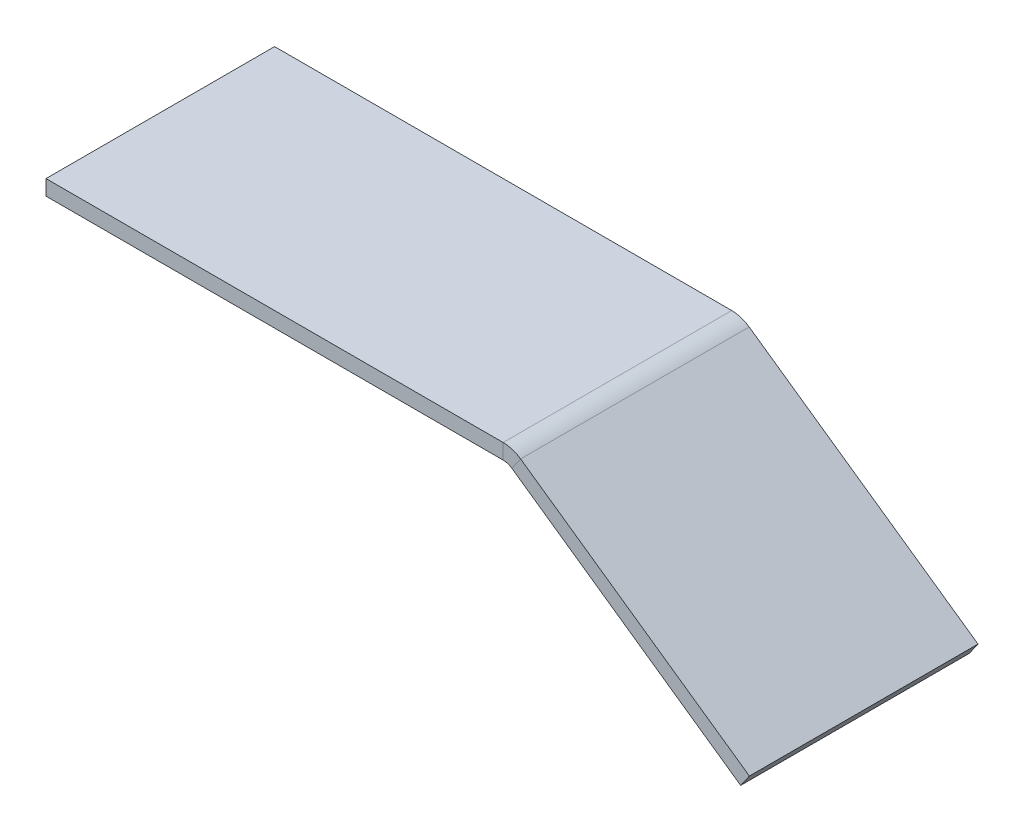
ISO-10303-21;
HEADER;
FILE_DESCRIPTION(('STEP AP214'),'2;1');
FILE_NAME('part.step','',(''),(''),'','','');
FILE_SCHEMA(('AUTOMOTIVE_DESIGN { 1 0 10303 214 1 1 1 1 }'));
ENDSEC;
DATA;
#1=APPLICATION_CONTEXT('core data for automotive mechanical design processes');
#2=APPLICATION_PROTOCOL_DEFINITION('international standard','automotive_design',2000,#1);
#3=PRODUCT_CONTEXT('',#1,'mechanical');
#4=PRODUCT('Part','Part','',(#3));
#5=PRODUCT_RELATED_PRODUCT_CATEGORY('part','',(#4));
#6=PRODUCT_DEFINITION_FORMATION('','',#4);
#7=PRODUCT_DEFINITION_CONTEXT('part definition',#1,'design');
#8=PRODUCT_DEFINITION('design','',#6,#7);
#9=PRODUCT_DEFINITION_SHAPE('','',#8);
#10=(LENGTH_UNIT() NAMED_UNIT(*) SI_UNIT(.MILLI.,.METRE.));
#11=(NAMED_UNIT(*) PLANE_ANGLE_UNIT() SI_UNIT($,.RADIAN.));
#12=(NAMED_UNIT(*) SI_UNIT($,.STERADIAN.) SOLID_ANGLE_UNIT());
#13=UNCERTAINTY_MEASURE_WITH_UNIT(LENGTH_MEASURE(1.E-05),#10,'distance_accuracy_value','');
#14=(GEOMETRIC_REPRESENTATION_CONTEXT(3) GLOBAL_UNCERTAINTY_ASSIGNED_CONTEXT((#13)) GLOBAL_UNIT_ASSIGNED_CONTEXT((#10,
#11,#12)) REPRESENTATION_CONTEXT('',''));
#15=CARTESIAN_POINT('',(0.,0.,0.));
#16=DIRECTION('',(0.,0.,1.));
#17=DIRECTION('',(1.,0.,0.));
#18=AXIS2_PLACEMENT_3D('',#15,#16,#17);
#19=CARTESIAN_POINT('',(4.13244235955301,-2.89356729137614,60.));
#20=DIRECTION('',(0.,0.,1.));
#21=DIRECTION('',(1.,0.,0.));
#22=AXIS2_PLACEMENT_3D('',#19,#20,#21);
#23=PLANE('',#22);
#24=DIRECTION('',(-0.573576436351047,-0.819152044288991,0.));
#25=VECTOR('',#24,1.);
#26=CARTESIAN_POINT('',(4.13244235955301,-2.89356729137614,60.));
#27=LINE('',#26,#25);
#28=CARTESIAN_POINT('',(4.13244235955301,-2.89356729137614,60.));
#29=VERTEX_POINT('',#28);
#30=CARTESIAN_POINT('',(-0.456169131255371,-9.44678364568807,60.));
#31=VERTEX_POINT('',#30);
#32=EDGE_CURVE('E11',#29,#31,#27,.T.);
#33=ORIENTED_EDGE('',*,*,#32,.F.);
#34=CARTESIAN_POINT('',(-5.04478062206375,-16.,60.));
#35=DIRECTION('',(0.,0.,1.));
#36=DIRECTION('',(1.,0.,0.));
#37=AXIS2_PLACEMENT_3D('',#34,#35,#36);
#38=CIRCLE('',#37,16.);
#39=CARTESIAN_POINT('',(-5.04478062206376,0.,60.));
#40=VERTEX_POINT('',#39);
#41=EDGE_CURVE('E133',#40,#29,#38,.F.);
#42=ORIENTED_EDGE('',*,*,#41,.F.);
#43=DIRECTION('',(0.,1.,0.));
#44=VECTOR('',#43,1.);
#45=CARTESIAN_POINT('',(-5.04478062206376,-8.,60.));
#46=LINE('',#45,#44);
#47=CARTESIAN_POINT('',(-5.04478062206376,-8.,60.));
#48=VERTEX_POINT('',#47);
#49=EDGE_CURVE('E45',#48,#40,#46,.T.);
#50=ORIENTED_EDGE('',*,*,#49,.F.);
#51=CARTESIAN_POINT('',(-5.04478062206375,-16.,60.));
#52=DIRECTION('',(0.,0.,1.));
#53=DIRECTION('',(1.,0.,0.));
#54=AXIS2_PLACEMENT_3D('',#51,#52,#53);
#55=CIRCLE('',#54,8.);
#56=EDGE_CURVE('E126',#48,#31,#55,.F.);
#57=ORIENTED_EDGE('',*,*,#56,.T.);
#58=EDGE_LOOP('',(#33,#42,#50,#57));
#59=FACE_BOUND('',#58,.T.);
#60=ADVANCED_FACE('F38',(#59),#23,.T.);
#61=CARTESIAN_POINT('',(-5.04478062206376,-8.,60.));
#62=DIRECTION('',(0.,0.,1.));
#63=DIRECTION('',(1.,0.,0.));
#64=AXIS2_PLACEMENT_3D('',#61,#62,#63);
#65=PLANE('',#64);
#66=DIRECTION('',(-0.573576436351048,-0.819152044288991,0.));
#67=VECTOR('',#66,1.);
#68=CARTESIAN_POINT('',(124.248876586564,-87.,60.));
#69=LINE('',#68,#67);
#70=CARTESIAN_POINT('',(124.248876586564,-87.,60.));
#71=VERTEX_POINT('',#70);
#72=CARTESIAN_POINT('',(119.660265095755,-93.5532163543119,60.));
#73=VERTEX_POINT('',#72);
#74=EDGE_CURVE('E331',#71,#73,#69,.T.);
#75=ORIENTED_EDGE('',*,*,#74,.F.);
#76=DIRECTION('',(0.819152044288991,-0.573576436351047,0.));
#77=VECTOR('',#76,1.);
#78=CARTESIAN_POINT('',(0.,0.,60.));
#79=LINE('',#78,#77);
#80=EDGE_CURVE('E175',#29,#71,#79,.T.);
#81=ORIENTED_EDGE('',*,*,#80,.F.);
#82=ORIENTED_EDGE('',*,*,#32,.T.);
#83=DIRECTION('',(0.819152044288991,-0.573576436351047,0.));
#84=VECTOR('',#83,1.);
#85=CARTESIAN_POINT('',(-4.58861149080838,-6.55321635431193,60.));
#86=LINE('',#85,#84);
#87=EDGE_CURVE('E155',#31,#73,#86,.T.);
#88=ORIENTED_EDGE('',*,*,#87,.T.);
#89=EDGE_LOOP('',(#75,#81,#82,#88));
#90=FACE_BOUND('',#89,.T.);
#91=ADVANCED_FACE('F184',(#90),#65,.T.);
#92=CARTESIAN_POINT('',(-5.04478062206376,0.,-60.));
#93=DIRECTION('',(0.,0.,-1.));
#94=DIRECTION('',(-1.,0.,0.));
#95=AXIS2_PLACEMENT_3D('',#92,#93,#94);
#96=PLANE('',#95);
#97=DIRECTION('',(0.,-1.,0.));
#98=VECTOR('',#97,1.);
#99=CARTESIAN_POINT('',(-5.04478062206376,0.,-60.));
#100=LINE('',#99,#98);
#101=CARTESIAN_POINT('',(-5.04478062206376,0.,-60.));
#102=VERTEX_POINT('',#101);
#103=CARTESIAN_POINT('',(-5.04478062206376,-8.,-60.));
#104=VERTEX_POINT('',#103);
#105=EDGE_CURVE('E167',#102,#104,#100,.T.);
#106=ORIENTED_EDGE('',*,*,#105,.F.);
#107=CARTESIAN_POINT('',(-5.04478062206375,-16.,-60.));
#108=DIRECTION('',(0.,0.,1.));
#109=DIRECTION('',(1.,0.,0.));
#110=AXIS2_PLACEMENT_3D('',#107,#108,#109);
#111=CIRCLE('',#110,16.);
#112=CARTESIAN_POINT('',(4.13244235955301,-2.89356729137614,-60.));
#113=VERTEX_POINT('',#112);
#114=EDGE_CURVE('E145',#102,#113,#111,.F.);
#115=ORIENTED_EDGE('',*,*,#114,.T.);
#116=DIRECTION('',(0.573576436351047,0.819152044288991,0.));
#117=VECTOR('',#116,1.);
#118=CARTESIAN_POINT('',(-0.456169131255371,-9.44678364568807,-60.));
#119=LINE('',#118,#117);
#120=CARTESIAN_POINT('',(-0.456169131255371,-9.44678364568807,-60.));
#121=VERTEX_POINT('',#120);
#122=EDGE_CURVE('E87',#121,#113,#119,.T.);
#123=ORIENTED_EDGE('',*,*,#122,.F.);
#124=CARTESIAN_POINT('',(-5.04478062206375,-16.,-60.));
#125=DIRECTION('',(0.,0.,1.));
#126=DIRECTION('',(1.,0.,0.));
#127=AXIS2_PLACEMENT_3D('',#124,#125,#126);
#128=CIRCLE('',#127,8.);
#129=EDGE_CURVE('E153',#104,#121,#128,.F.);
#130=ORIENTED_EDGE('',*,*,#129,.F.);
#131=EDGE_LOOP('',(#106,#115,#123,#130));
#132=FACE_BOUND('',#131,.T.);
#133=ADVANCED_FACE('F182',(#132),#96,.T.);
#134=CARTESIAN_POINT('',(-0.456169131255371,-9.44678364568807,-60.));
#135=DIRECTION('',(0.,0.,-1.));
#136=DIRECTION('',(-1.,0.,0.));
#137=AXIS2_PLACEMENT_3D('',#134,#135,#136);
#138=PLANE('',#137);
#139=DIRECTION('',(1.,0.,0.));
#140=VECTOR('',#139,1.);
#141=CARTESIAN_POINT('',(-245.,0.,-60.));
#142=LINE('',#141,#140);
#143=CARTESIAN_POINT('',(-245.,0.,-60.));
#144=VERTEX_POINT('',#143);
#145=EDGE_CURVE('E147',#144,#102,#142,.T.);
#146=ORIENTED_EDGE('',*,*,#145,.T.);
#147=ORIENTED_EDGE('',*,*,#105,.T.);
#148=DIRECTION('',(1.,0.,0.));
#149=VECTOR('',#148,1.);
#150=CARTESIAN_POINT('',(-245.,-8.,-60.));
#151=LINE('',#150,#149);
#152=CARTESIAN_POINT('',(-245.,-8.,-60.));
#153=VERTEX_POINT('',#152);
#154=EDGE_CURVE('E151',#153,#104,#151,.T.);
#155=ORIENTED_EDGE('',*,*,#154,.F.);
#156=DIRECTION('',(0.,1.,0.));
#157=VECTOR('',#156,1.);
#158=CARTESIAN_POINT('',(-245.,-8.,-60.));
#159=LINE('',#158,#157);
#160=EDGE_CURVE('E112',#153,#144,#159,.T.);
#161=ORIENTED_EDGE('',*,*,#160,.T.);
#162=EDGE_LOOP('',(#146,#147,#155,#161));
#163=FACE_BOUND('',#162,.T.);
#164=ADVANCED_FACE('F178',(#163),#138,.T.);
#165=CARTESIAN_POINT('',(-4.58861149080838,-6.55321635431193,60.));
#166=DIRECTION('',(0.573576436351047,0.819152044288991,0.));
#167=DIRECTION('',(-0.819152044288991,0.573576436351047,0.));
#168=AXIS2_PLACEMENT_3D('',#165,#166,#167);
#169=PLANE('',#168);
#170=DIRECTION('',(0.819152044288991,-0.573576436351047,0.));
#171=VECTOR('',#170,1.);
#172=CARTESIAN_POINT('',(-4.58861149080838,-6.55321635431193,-60.));
#173=LINE('',#172,#171);
#174=CARTESIAN_POINT('',(119.660265095755,-93.5532163543119,-60.));
#175=VERTEX_POINT('',#174);
#176=EDGE_CURVE('E139',#121,#175,#173,.T.);
#177=ORIENTED_EDGE('',*,*,#176,.T.);
#178=DIRECTION('',(0.,0.,1.));
#179=VECTOR('',#178,1.);
#180=CARTESIAN_POINT('',(119.660265095755,-93.5532163543119,-60.));
#181=LINE('',#180,#179);
#182=EDGE_CURVE('E52',#175,#73,#181,.T.);
#183=ORIENTED_EDGE('',*,*,#182,.T.);
#184=ORIENTED_EDGE('',*,*,#87,.F.);
#185=DIRECTION('',(0.,0.,-1.));
#186=VECTOR('',#185,1.);
#187=CARTESIAN_POINT('',(-0.456169131255371,-9.44678364568807,60.));
#188=LINE('',#187,#186);
#189=EDGE_CURVE('E138',#31,#121,#188,.T.);
#190=ORIENTED_EDGE('',*,*,#189,.T.);
#191=EDGE_LOOP('',(#177,#183,#184,#190));
#192=FACE_BOUND('',#191,.T.);
#193=ADVANCED_FACE('F190',(#192),#169,.F.);
#194=CARTESIAN_POINT('',(0.,0.,60.));
#195=DIRECTION('',(0.573576436351047,0.819152044288991,0.));
#196=DIRECTION('',(-0.819152044288991,0.573576436351047,0.));
#197=AXIS2_PLACEMENT_3D('',#194,#195,#196);
#198=PLANE('',#197);
#199=DIRECTION('',(0.,0.,1.));
#200=VECTOR('',#199,1.);
#201=CARTESIAN_POINT('',(124.248876586564,-87.,-60.));
#202=LINE('',#201,#200);
#203=CARTESIAN_POINT('',(124.248876586564,-87.,-60.));
#204=VERTEX_POINT('',#203);
#205=EDGE_CURVE('E334',#204,#71,#202,.T.);
#206=ORIENTED_EDGE('',*,*,#205,.F.);
#207=DIRECTION('',(0.819152044288991,-0.573576436351047,0.));
#208=VECTOR('',#207,1.);
#209=CARTESIAN_POINT('',(0.,0.,-60.));
#210=LINE('',#209,#208);
#211=EDGE_CURVE('E142',#113,#204,#210,.T.);
#212=ORIENTED_EDGE('',*,*,#211,.F.);
#213=DIRECTION('',(0.,0.,-1.));
#214=VECTOR('',#213,1.);
#215=CARTESIAN_POINT('',(4.13244235955301,-2.89356729137614,60.));
#216=LINE('',#215,#214);
#217=EDGE_CURVE('E163',#29,#113,#216,.T.);
#218=ORIENTED_EDGE('',*,*,#217,.F.);
#219=ORIENTED_EDGE('',*,*,#80,.T.);
#220=EDGE_LOOP('',(#206,#212,#218,#219));
#221=FACE_BOUND('',#220,.T.);
#222=ADVANCED_FACE('F215',(#221),#198,.T.);
#223=CARTESIAN_POINT('',(-5.04478062206375,-16.,60.));
#224=DIRECTION('',(0.,0.,-1.));
#225=DIRECTION('',(-1.,0.,0.));
#226=AXIS2_PLACEMENT_3D('',#223,#224,#225);
#227=CYLINDRICAL_SURFACE('',#226,16.);
#228=ORIENTED_EDGE('',*,*,#114,.F.);
#229=DIRECTION('',(0.,0.,-1.));
#230=VECTOR('',#229,1.);
#231=CARTESIAN_POINT('',(-5.04478062206376,0.,60.));
#232=LINE('',#231,#230);
#233=EDGE_CURVE('E160',#40,#102,#232,.T.);
#234=ORIENTED_EDGE('',*,*,#233,.F.);
#235=ORIENTED_EDGE('',*,*,#41,.T.);
#236=ORIENTED_EDGE('',*,*,#217,.T.);
#237=EDGE_LOOP('',(#228,#234,#235,#236));
#238=FACE_BOUND('',#237,.T.);
#239=ADVANCED_FACE('F172',(#238),#227,.T.);
#240=CARTESIAN_POINT('',(-245.,0.,60.));
#241=DIRECTION('',(0.,1.,0.));
#242=DIRECTION('',(0.,0.,1.));
#243=AXIS2_PLACEMENT_3D('',#240,#241,#242);
#244=PLANE('',#243);
#245=ORIENTED_EDGE('',*,*,#145,.F.);
#246=DIRECTION('',(0.,0.,-1.));
#247=VECTOR('',#246,1.);
#248=CARTESIAN_POINT('',(-245.,0.,60.));
#249=LINE('',#248,#247);
#250=CARTESIAN_POINT('',(-245.,0.,60.));
#251=VERTEX_POINT('',#250);
#252=EDGE_CURVE('E116',#251,#144,#249,.T.);
#253=ORIENTED_EDGE('',*,*,#252,.F.);
#254=DIRECTION('',(1.,0.,0.));
#255=VECTOR('',#254,1.);
#256=CARTESIAN_POINT('',(-245.,0.,60.));
#257=LINE('',#256,#255);
#258=EDGE_CURVE('E131',#251,#40,#257,.T.);
#259=ORIENTED_EDGE('',*,*,#258,.T.);
#260=ORIENTED_EDGE('',*,*,#233,.T.);
#261=EDGE_LOOP('',(#245,#253,#259,#260));
#262=FACE_BOUND('',#261,.T.);
#263=ADVANCED_FACE('F176',(#262),#244,.T.);
#264=CARTESIAN_POINT('',(-245.,-8.,60.));
#265=DIRECTION('',(-1.,0.,0.));
#266=DIRECTION('',(0.,0.,1.));
#267=AXIS2_PLACEMENT_3D('',#264,#265,#266);
#268=PLANE('',#267);
#269=ORIENTED_EDGE('',*,*,#160,.F.);
#270=DIRECTION('',(0.,0.,-1.));
#271=VECTOR('',#270,1.);
#272=CARTESIAN_POINT('',(-245.,-8.,60.));
#273=LINE('',#272,#271);
#274=CARTESIAN_POINT('',(-245.,-8.,60.));
#275=VERTEX_POINT('',#274);
#276=EDGE_CURVE('E106',#275,#153,#273,.T.);
#277=ORIENTED_EDGE('',*,*,#276,.F.);
#278=DIRECTION('',(0.,1.,0.));
#279=VECTOR('',#278,1.);
#280=CARTESIAN_POINT('',(-245.,-8.,60.));
#281=LINE('',#280,#279);
#282=EDGE_CURVE('E110',#275,#251,#281,.T.);
#283=ORIENTED_EDGE('',*,*,#282,.T.);
#284=ORIENTED_EDGE('',*,*,#252,.T.);
#285=EDGE_LOOP('',(#269,#277,#283,#284));
#286=FACE_BOUND('',#285,.T.);
#287=ADVANCED_FACE('F108',(#286),#268,.T.);
#288=CARTESIAN_POINT('',(-245.,-8.,60.));
#289=DIRECTION('',(0.,1.,0.));
#290=DIRECTION('',(0.,0.,1.));
#291=AXIS2_PLACEMENT_3D('',#288,#289,#290);
#292=PLANE('',#291);
#293=ORIENTED_EDGE('',*,*,#154,.T.);
#294=DIRECTION('',(0.,0.,-1.));
#295=VECTOR('',#294,1.);
#296=CARTESIAN_POINT('',(-5.04478062206376,-8.,60.));
#297=LINE('',#296,#295);
#298=EDGE_CURVE('E117',#48,#104,#297,.T.);
#299=ORIENTED_EDGE('',*,*,#298,.F.);
#300=DIRECTION('',(1.,0.,0.));
#301=VECTOR('',#300,1.);
#302=CARTESIAN_POINT('',(-245.,-8.,60.));
#303=LINE('',#302,#301);
#304=EDGE_CURVE('E121',#275,#48,#303,.T.);
#305=ORIENTED_EDGE('',*,*,#304,.F.);
#306=ORIENTED_EDGE('',*,*,#276,.T.);
#307=EDGE_LOOP('',(#293,#299,#305,#306));
#308=FACE_BOUND('',#307,.T.);
#309=ADVANCED_FACE('F122',(#308),#292,.F.);
#310=CARTESIAN_POINT('',(-5.04478062206375,-16.,60.));
#311=DIRECTION('',(0.,0.,-1.));
#312=DIRECTION('',(-1.,0.,0.));
#313=AXIS2_PLACEMENT_3D('',#310,#311,#312);
#314=CYLINDRICAL_SURFACE('',#313,8.);
#315=ORIENTED_EDGE('',*,*,#129,.T.);
#316=ORIENTED_EDGE('',*,*,#189,.F.);
#317=ORIENTED_EDGE('',*,*,#56,.F.);
#318=ORIENTED_EDGE('',*,*,#298,.T.);
#319=EDGE_LOOP('',(#315,#316,#317,#318));
#320=FACE_BOUND('',#319,.T.);
#321=ADVANCED_FACE('F180',(#320),#314,.F.);
#322=CARTESIAN_POINT('',(-5.04478062206375,-16.,60.));
#323=DIRECTION('',(0.,0.,1.));
#324=DIRECTION('',(1.,0.,0.));
#325=AXIS2_PLACEMENT_3D('',#322,#323,#324);
#326=PLANE('',#325);
#327=ORIENTED_EDGE('',*,*,#304,.T.);
#328=ORIENTED_EDGE('',*,*,#49,.T.);
#329=ORIENTED_EDGE('',*,*,#258,.F.);
#330=ORIENTED_EDGE('',*,*,#282,.F.);
#331=EDGE_LOOP('',(#327,#328,#329,#330));
#332=FACE_BOUND('',#331,.T.);
#333=ADVANCED_FACE('F129',(#332),#326,.T.);
#334=CARTESIAN_POINT('',(-5.04478062206375,-16.,-60.));
#335=DIRECTION('',(0.,0.,1.));
#336=DIRECTION('',(1.,0.,0.));
#337=AXIS2_PLACEMENT_3D('',#334,#335,#336);
#338=PLANE('',#337);
#339=ORIENTED_EDGE('',*,*,#211,.T.);
#340=DIRECTION('',(-0.573576436351048,-0.819152044288991,0.));
#341=VECTOR('',#340,1.);
#342=CARTESIAN_POINT('',(124.248876586564,-87.,-60.));
#343=LINE('',#342,#341);
#344=EDGE_CURVE('E336',#204,#175,#343,.T.);
#345=ORIENTED_EDGE('',*,*,#344,.T.);
#346=ORIENTED_EDGE('',*,*,#176,.F.);
#347=ORIENTED_EDGE('',*,*,#122,.T.);
#348=EDGE_LOOP('',(#339,#345,#346,#347));
#349=FACE_BOUND('',#348,.T.);
#350=ADVANCED_FACE('F235',(#349),#338,.F.);
#351=CARTESIAN_POINT('',(124.248876586564,-87.,-60.));
#352=DIRECTION('',(-0.819152044288991,0.573576436351047,0.));
#353=DIRECTION('',(-0.573576436351048,-0.819152044288991,0.));
#354=AXIS2_PLACEMENT_3D('',#351,#352,#353);
#355=PLANE('',#354);
#356=ORIENTED_EDGE('',*,*,#74,.T.);
#357=ORIENTED_EDGE('',*,*,#182,.F.);
#358=ORIENTED_EDGE('',*,*,#344,.F.);
#359=ORIENTED_EDGE('',*,*,#205,.T.);
#360=EDGE_LOOP('',(#356,#357,#358,#359));
#361=FACE_BOUND('',#360,.T.);
#362=ADVANCED_FACE('F240',(#361),#355,.F.);
#363=CLOSED_SHELL('',(#60,#91,#133,#164,#193,#222,#239,#263,#287,#309,#321,#333,#350,#362));
#364=MANIFOLD_SOLID_BREP('B2',#363);
#365=ADVANCED_BREP_SHAPE_REPRESENTATION('',(#18,#364),#14);
#366=SHAPE_DEFINITION_REPRESENTATION(#9,#365);
ENDSEC;
END-ISO-10303-21;
